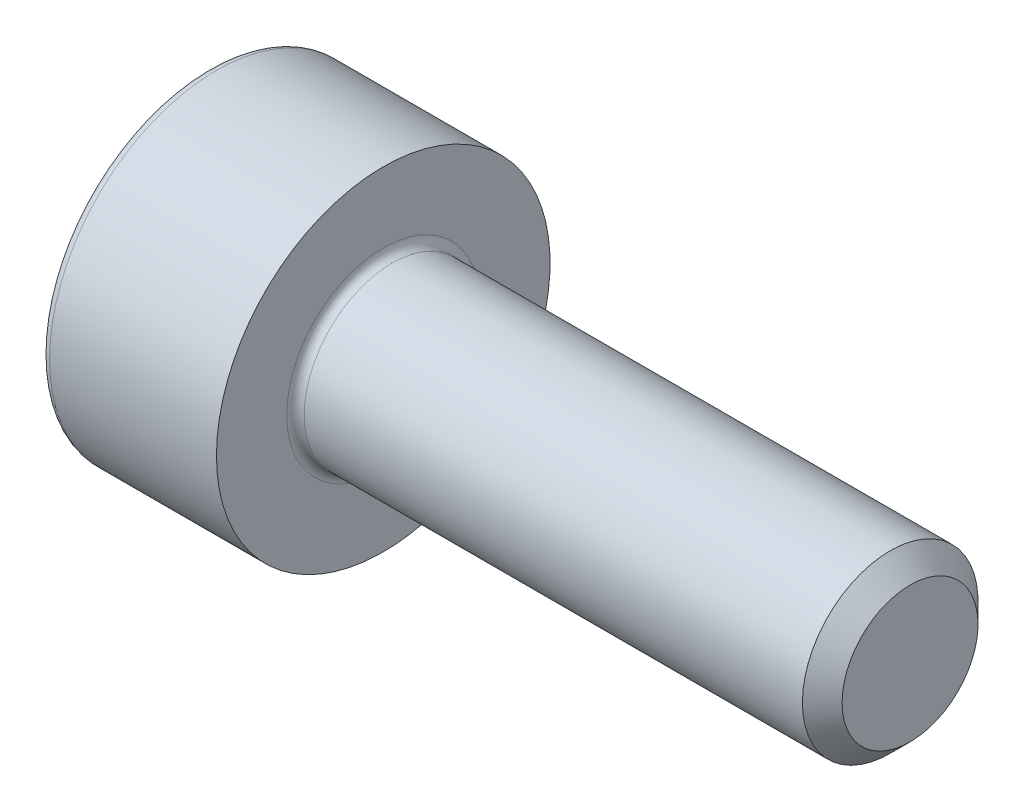
ISO-10303-21;
HEADER;
FILE_DESCRIPTION(('STEP AP214'),'2;1');
FILE_NAME('part.step','',(''),(''),'','','');
FILE_SCHEMA(('AUTOMOTIVE_DESIGN { 1 0 10303 214 1 1 1 1 }'));
ENDSEC;
DATA;
#1=APPLICATION_CONTEXT('core data for automotive mechanical design processes');
#2=APPLICATION_PROTOCOL_DEFINITION('international standard','automotive_design',2000,#1);
#3=PRODUCT_CONTEXT('',#1,'mechanical');
#4=PRODUCT('Part','Part','',(#3));
#5=PRODUCT_RELATED_PRODUCT_CATEGORY('part','',(#4));
#6=PRODUCT_DEFINITION_FORMATION('','',#4);
#7=PRODUCT_DEFINITION_CONTEXT('part definition',#1,'design');
#8=PRODUCT_DEFINITION('design','',#6,#7);
#9=PRODUCT_DEFINITION_SHAPE('','',#8);
#10=(LENGTH_UNIT() NAMED_UNIT(*) SI_UNIT(.MILLI.,.METRE.));
#11=(NAMED_UNIT(*) PLANE_ANGLE_UNIT() SI_UNIT($,.RADIAN.));
#12=(NAMED_UNIT(*) SI_UNIT($,.STERADIAN.) SOLID_ANGLE_UNIT());
#13=UNCERTAINTY_MEASURE_WITH_UNIT(LENGTH_MEASURE(1.E-05),#10,'distance_accuracy_value','');
#14=(GEOMETRIC_REPRESENTATION_CONTEXT(3) GLOBAL_UNCERTAINTY_ASSIGNED_CONTEXT((#13)) GLOBAL_UNIT_ASSIGNED_CONTEXT((#10,
#11,#12)) REPRESENTATION_CONTEXT('',''));
#15=CARTESIAN_POINT('',(0.,0.,0.));
#16=DIRECTION('',(0.,0.,1.));
#17=DIRECTION('',(1.,0.,0.));
#18=AXIS2_PLACEMENT_3D('',#15,#16,#17);
#19=CARTESIAN_POINT('',(0.,0.,0.));
#20=DIRECTION('',(-1.,0.,0.));
#21=DIRECTION('',(0.,0.,1.));
#22=AXIS2_PLACEMENT_3D('',#19,#20,#21);
#23=PLANE('',#22);
#24=DIRECTION('',(0.,-0.499999999999999,0.866025403784439));
#25=VECTOR('',#24,1.);
#26=CARTESIAN_POINT('',(0.,0.892006165897972,0.));
#27=LINE('',#26,#25);
#28=CARTESIAN_POINT('',(0.,0.892006165897972,0.));
#29=VERTEX_POINT('',#28);
#30=CARTESIAN_POINT('',(0.,0.446003082948987,0.772499999999999));
#31=VERTEX_POINT('',#30);
#32=EDGE_CURVE('E265',#29,#31,#27,.T.);
#33=ORIENTED_EDGE('',*,*,#32,.T.);
#34=DIRECTION('',(0.,1.,0.));
#35=VECTOR('',#34,1.);
#36=CARTESIAN_POINT('',(0.,-0.446003082948984,0.7725));
#37=LINE('',#36,#35);
#38=CARTESIAN_POINT('',(0.,-0.446003082948984,0.7725));
#39=VERTEX_POINT('',#38);
#40=EDGE_CURVE('E137',#39,#31,#37,.T.);
#41=ORIENTED_EDGE('',*,*,#40,.F.);
#42=DIRECTION('',(0.,-0.500000000000001,-0.866025403784438));
#43=VECTOR('',#42,1.);
#44=CARTESIAN_POINT('',(0.,-0.446003082948984,0.7725));
#45=LINE('',#44,#43);
#46=CARTESIAN_POINT('',(0.,-0.892006165897971,0.));
#47=VERTEX_POINT('',#46);
#48=EDGE_CURVE('E268',#39,#47,#45,.T.);
#49=ORIENTED_EDGE('',*,*,#48,.T.);
#50=DIRECTION('',(0.,0.499999999999997,-0.86602540378444));
#51=VECTOR('',#50,1.);
#52=CARTESIAN_POINT('',(0.,-0.892006165897971,0.));
#53=LINE('',#52,#51);
#54=CARTESIAN_POINT('',(0.,-0.446003082948987,-0.772500000000001));
#55=VERTEX_POINT('',#54);
#56=EDGE_CURVE('E271',#47,#55,#53,.T.);
#57=ORIENTED_EDGE('',*,*,#56,.T.);
#58=DIRECTION('',(0.,-1.,0.));
#59=VECTOR('',#58,1.);
#60=CARTESIAN_POINT('',(0.,0.446003082948986,-0.772500000000001));
#61=LINE('',#60,#59);
#62=CARTESIAN_POINT('',(0.,0.446003082948986,-0.772500000000001));
#63=VERTEX_POINT('',#62);
#64=EDGE_CURVE('E274',#63,#55,#61,.T.);
#65=ORIENTED_EDGE('',*,*,#64,.F.);
#66=DIRECTION('',(0.,-0.500000000000001,-0.866025403784438));
#67=VECTOR('',#66,1.);
#68=CARTESIAN_POINT('',(0.,0.892006165897972,0.));
#69=LINE('',#68,#67);
#70=EDGE_CURVE('E132',#29,#63,#69,.T.);
#71=ORIENTED_EDGE('',*,*,#70,.F.);
#72=EDGE_LOOP('',(#33,#41,#49,#57,#65,#71));
#73=FACE_BOUND('',#72,.T.);
#74=CARTESIAN_POINT('',(0.,0.,0.));
#75=DIRECTION('',(-1.,0.,0.));
#76=DIRECTION('',(0.,0.,1.));
#77=AXIS2_PLACEMENT_3D('',#74,#75,#76);
#78=CIRCLE('',#77,1.8);
#79=CARTESIAN_POINT('',(0.,0.,1.8));
#80=VERTEX_POINT('',#79);
#81=EDGE_CURVE('E49',#80,#80,#78,.T.);
#82=ORIENTED_EDGE('',*,*,#81,.T.);
#83=EDGE_LOOP('',(#82));
#84=FACE_BOUND('',#83,.T.);
#85=ADVANCED_FACE('F41',(#73,#84),#23,.T.);
#86=CARTESIAN_POINT('',(-31.75,0.,0.));
#87=DIRECTION('',(-1.,0.,0.));
#88=DIRECTION('',(0.,0.,1.));
#89=AXIS2_PLACEMENT_3D('',#86,#87,#88);
#90=CYLINDRICAL_SURFACE('',#89,1.9);
#91=CARTESIAN_POINT('',(0.100000000000003,0.,0.));
#92=DIRECTION('',(-1.,0.,0.));
#93=DIRECTION('',(0.,0.,1.));
#94=AXIS2_PLACEMENT_3D('',#91,#92,#93);
#95=CIRCLE('',#94,1.9);
#96=CARTESIAN_POINT('',(0.100000000000003,0.,1.9));
#97=VERTEX_POINT('',#96);
#98=EDGE_CURVE('E11',#97,#97,#95,.F.);
#99=ORIENTED_EDGE('',*,*,#98,.T.);
#100=EDGE_LOOP('',(#99));
#101=FACE_BOUND('',#100,.T.);
#102=CARTESIAN_POINT('',(2.,0.,0.));
#103=DIRECTION('',(-1.,0.,0.));
#104=DIRECTION('',(0.,0.,1.));
#105=AXIS2_PLACEMENT_3D('',#102,#103,#104);
#106=CIRCLE('',#105,1.9);
#107=CARTESIAN_POINT('',(2.,0.,1.9));
#108=VERTEX_POINT('',#107);
#109=EDGE_CURVE('E155',#108,#108,#106,.T.);
#110=ORIENTED_EDGE('',*,*,#109,.T.);
#111=EDGE_LOOP('',(#110));
#112=FACE_BOUND('',#111,.T.);
#113=ADVANCED_FACE('F179',(#101,#112),#90,.T.);
#114=CARTESIAN_POINT('',(2.,1.9,0.));
#115=DIRECTION('',(1.,0.,0.));
#116=DIRECTION('',(0.,0.,-1.));
#117=AXIS2_PLACEMENT_3D('',#114,#115,#116);
#118=PLANE('',#117);
#119=CARTESIAN_POINT('',(2.,0.,0.));
#120=DIRECTION('',(1.,0.,0.));
#121=DIRECTION('',(0.,0.,-1.));
#122=AXIS2_PLACEMENT_3D('',#119,#120,#121);
#123=CIRCLE('',#122,1.1);
#124=CARTESIAN_POINT('',(2.,0.,-1.1));
#125=VERTEX_POINT('',#124);
#126=EDGE_CURVE('E158',#125,#125,#123,.F.);
#127=ORIENTED_EDGE('',*,*,#126,.T.);
#128=EDGE_LOOP('',(#127));
#129=FACE_BOUND('',#128,.T.);
#130=ORIENTED_EDGE('',*,*,#109,.F.);
#131=EDGE_LOOP('',(#130));
#132=FACE_BOUND('',#131,.T.);
#133=ADVANCED_FACE('F185',(#129,#132),#118,.T.);
#134=CARTESIAN_POINT('',(-31.75,0.,0.));
#135=DIRECTION('',(-1.,0.,0.));
#136=DIRECTION('',(0.,0.,1.));
#137=AXIS2_PLACEMENT_3D('',#134,#135,#136);
#138=CYLINDRICAL_SURFACE('',#137,1.);
#139=CARTESIAN_POINT('',(2.1,0.,0.));
#140=DIRECTION('',(1.,0.,0.));
#141=DIRECTION('',(0.,0.,-1.));
#142=AXIS2_PLACEMENT_3D('',#139,#140,#141);
#143=CIRCLE('',#142,1.);
#144=CARTESIAN_POINT('',(2.1,0.,-1.));
#145=VERTEX_POINT('',#144);
#146=EDGE_CURVE('E161',#145,#145,#143,.T.);
#147=ORIENTED_EDGE('',*,*,#146,.T.);
#148=EDGE_LOOP('',(#147));
#149=FACE_BOUND('',#148,.T.);
#150=CARTESIAN_POINT('',(7.77400000000002,0.,0.));
#151=DIRECTION('',(-1.,0.,0.));
#152=DIRECTION('',(0.,0.,1.));
#153=AXIS2_PLACEMENT_3D('',#150,#151,#152);
#154=CIRCLE('',#153,1.);
#155=CARTESIAN_POINT('',(7.77400000000002,0.,1.));
#156=VERTEX_POINT('',#155);
#157=EDGE_CURVE('E152',#156,#156,#154,.T.);
#158=ORIENTED_EDGE('',*,*,#157,.T.);
#159=EDGE_LOOP('',(#158));
#160=FACE_BOUND('',#159,.T.);
#161=ADVANCED_FACE('F191',(#149,#160),#138,.T.);
#162=CARTESIAN_POINT('',(8.00000000000001,0.,0.));
#163=DIRECTION('',(-1.,0.,0.));
#164=DIRECTION('',(0.,0.,1.));
#165=AXIS2_PLACEMENT_3D('',#162,#163,#164);
#166=CONICAL_SURFACE('',#165,0.774,0.785398163397475);
#167=ORIENTED_EDGE('',*,*,#157,.F.);
#168=EDGE_LOOP('',(#167));
#169=FACE_BOUND('',#168,.T.);
#170=CARTESIAN_POINT('',(8.00000000000001,0.,0.));
#171=DIRECTION('',(-1.,0.,0.));
#172=DIRECTION('',(0.,0.,1.));
#173=AXIS2_PLACEMENT_3D('',#170,#171,#172);
#174=CIRCLE('',#173,0.774);
#175=CARTESIAN_POINT('',(8.00000000000001,0.,0.774));
#176=VERTEX_POINT('',#175);
#177=EDGE_CURVE('E148',#176,#176,#174,.T.);
#178=ORIENTED_EDGE('',*,*,#177,.T.);
#179=EDGE_LOOP('',(#178));
#180=FACE_BOUND('',#179,.T.);
#181=ADVANCED_FACE('F195',(#169,#180),#166,.T.);
#182=CARTESIAN_POINT('',(8.00000000000001,0.774,0.));
#183=DIRECTION('',(1.,0.,0.));
#184=DIRECTION('',(0.,0.,-1.));
#185=AXIS2_PLACEMENT_3D('',#182,#183,#184);
#186=PLANE('',#185);
#187=ORIENTED_EDGE('',*,*,#177,.F.);
#188=EDGE_LOOP('',(#187));
#189=FACE_BOUND('',#188,.T.);
#190=ADVANCED_FACE('F175',(#189),#186,.T.);
#191=CARTESIAN_POINT('',(2.1,0.,0.));
#192=DIRECTION('',(1.,0.,0.));
#193=DIRECTION('',(0.,0.,-1.));
#194=AXIS2_PLACEMENT_3D('',#191,#192,#193);
#195=TOROIDAL_SURFACE('',#194,1.1,0.1);
#196=ORIENTED_EDGE('',*,*,#146,.F.);
#197=EDGE_LOOP('',(#196));
#198=FACE_BOUND('',#197,.T.);
#199=ORIENTED_EDGE('',*,*,#126,.F.);
#200=EDGE_LOOP('',(#199));
#201=FACE_BOUND('',#200,.T.);
#202=ADVANCED_FACE('F168',(#198,#201),#195,.F.);
#203=CARTESIAN_POINT('',(0.100000000000003,0.,0.));
#204=DIRECTION('',(-1.,0.,0.));
#205=DIRECTION('',(0.,0.,1.));
#206=AXIS2_PLACEMENT_3D('',#203,#204,#205);
#207=TOROIDAL_SURFACE('',#206,1.8,0.1);
#208=ORIENTED_EDGE('',*,*,#98,.F.);
#209=EDGE_LOOP('',(#208));
#210=FACE_BOUND('',#209,.T.);
#211=ORIENTED_EDGE('',*,*,#81,.F.);
#212=EDGE_LOOP('',(#211));
#213=FACE_BOUND('',#212,.T.);
#214=ADVANCED_FACE('F43',(#210,#213),#207,.T.);
#215=CARTESIAN_POINT('',(1.,0.892006165897972,0.));
#216=DIRECTION('',(0.,-0.866025403784439,-0.499999999999999));
#217=DIRECTION('',(0.,0.499999999999999,-0.866025403784439));
#218=AXIS2_PLACEMENT_3D('',#215,#216,#217);
#219=PLANE('',#218);
#220=ORIENTED_EDGE('',*,*,#32,.F.);
#221=DIRECTION('',(-1.,0.,0.));
#222=VECTOR('',#221,1.);
#223=CARTESIAN_POINT('',(1.,0.892006165897972,0.));
#224=LINE('',#223,#222);
#225=CARTESIAN_POINT('',(1.,0.892006165897972,0.));
#226=VERTEX_POINT('',#225);
#227=EDGE_CURVE('E255',#226,#29,#224,.T.);
#228=ORIENTED_EDGE('',*,*,#227,.F.);
#229=DIRECTION('',(0.,-0.499999999999999,0.866025403784439));
#230=VECTOR('',#229,1.);
#231=CARTESIAN_POINT('',(1.,0.892006165897972,0.));
#232=LINE('',#231,#230);
#233=CARTESIAN_POINT('',(1.,0.669004624423479,0.386249999999999));
#234=VERTEX_POINT('',#233);
#235=EDGE_CURVE('E124',#226,#234,#232,.T.);
#236=ORIENTED_EDGE('',*,*,#235,.T.);
#237=CARTESIAN_POINT('',(1.,0.446003082948987,0.772499999999999));
#238=VERTEX_POINT('',#237);
#239=EDGE_CURVE('E115',#234,#238,#232,.T.);
#240=ORIENTED_EDGE('',*,*,#239,.T.);
#241=DIRECTION('',(-1.,0.,0.));
#242=VECTOR('',#241,1.);
#243=CARTESIAN_POINT('',(1.,0.446003082948987,0.772499999999999));
#244=LINE('',#243,#242);
#245=EDGE_CURVE('E129',#238,#31,#244,.T.);
#246=ORIENTED_EDGE('',*,*,#245,.T.);
#247=EDGE_LOOP('',(#220,#228,#236,#240,#246));
#248=FACE_BOUND('',#247,.T.);
#249=ADVANCED_FACE('F128',(#248),#219,.T.);
#250=CARTESIAN_POINT('',(1.,-0.446003082948984,0.7725));
#251=DIRECTION('',(0.,0.,1.));
#252=DIRECTION('',(0.,-1.,0.));
#253=AXIS2_PLACEMENT_3D('',#250,#251,#252);
#254=PLANE('',#253);
#255=ORIENTED_EDGE('',*,*,#40,.T.);
#256=ORIENTED_EDGE('',*,*,#245,.F.);
#257=DIRECTION('',(0.,1.,0.));
#258=VECTOR('',#257,1.);
#259=CARTESIAN_POINT('',(1.,-0.446003082948984,0.7725));
#260=LINE('',#259,#258);
#261=CARTESIAN_POINT('',(1.,0.,0.772499999999999));
#262=VERTEX_POINT('',#261);
#263=EDGE_CURVE('E112',#262,#238,#260,.T.);
#264=ORIENTED_EDGE('',*,*,#263,.F.);
#265=CARTESIAN_POINT('',(1.,-0.446003082948984,0.7725));
#266=VERTEX_POINT('',#265);
#267=EDGE_CURVE('E123',#266,#262,#260,.T.);
#268=ORIENTED_EDGE('',*,*,#267,.F.);
#269=DIRECTION('',(-1.,0.,0.));
#270=VECTOR('',#269,1.);
#271=CARTESIAN_POINT('',(1.,-0.446003082948984,0.7725));
#272=LINE('',#271,#270);
#273=EDGE_CURVE('E139',#266,#39,#272,.T.);
#274=ORIENTED_EDGE('',*,*,#273,.T.);
#275=EDGE_LOOP('',(#255,#256,#264,#268,#274));
#276=FACE_BOUND('',#275,.T.);
#277=ADVANCED_FACE('F134',(#276),#254,.F.);
#278=CARTESIAN_POINT('',(1.,-0.446003082948984,0.7725));
#279=DIRECTION('',(0.,0.866025403784438,-0.500000000000001));
#280=DIRECTION('',(0.,0.500000000000001,0.866025403784438));
#281=AXIS2_PLACEMENT_3D('',#278,#279,#280);
#282=PLANE('',#281);
#283=ORIENTED_EDGE('',*,*,#48,.F.);
#284=ORIENTED_EDGE('',*,*,#273,.F.);
#285=DIRECTION('',(0.,-0.500000000000001,-0.866025403784438));
#286=VECTOR('',#285,1.);
#287=CARTESIAN_POINT('',(1.,-0.446003082948984,0.7725));
#288=LINE('',#287,#286);
#289=CARTESIAN_POINT('',(1.,-0.669004624423477,0.38625));
#290=VERTEX_POINT('',#289);
#291=EDGE_CURVE('E294',#266,#290,#288,.T.);
#292=ORIENTED_EDGE('',*,*,#291,.T.);
#293=CARTESIAN_POINT('',(1.,-0.892006165897971,0.));
#294=VERTEX_POINT('',#293);
#295=EDGE_CURVE('E283',#290,#294,#288,.T.);
#296=ORIENTED_EDGE('',*,*,#295,.T.);
#297=DIRECTION('',(-1.,0.,0.));
#298=VECTOR('',#297,1.);
#299=CARTESIAN_POINT('',(1.,-0.892006165897971,0.));
#300=LINE('',#299,#298);
#301=EDGE_CURVE('E144',#294,#47,#300,.T.);
#302=ORIENTED_EDGE('',*,*,#301,.T.);
#303=EDGE_LOOP('',(#283,#284,#292,#296,#302));
#304=FACE_BOUND('',#303,.T.);
#305=ADVANCED_FACE('F209',(#304),#282,.T.);
#306=CARTESIAN_POINT('',(1.,-0.892006165897971,0.));
#307=DIRECTION('',(0.,0.86602540378444,0.499999999999997));
#308=DIRECTION('',(0.,-0.499999999999997,0.86602540378444));
#309=AXIS2_PLACEMENT_3D('',#306,#307,#308);
#310=PLANE('',#309);
#311=ORIENTED_EDGE('',*,*,#56,.F.);
#312=ORIENTED_EDGE('',*,*,#301,.F.);
#313=DIRECTION('',(0.,0.499999999999997,-0.86602540378444));
#314=VECTOR('',#313,1.);
#315=CARTESIAN_POINT('',(1.,-0.892006165897971,0.));
#316=LINE('',#315,#314);
#317=CARTESIAN_POINT('',(1.,-0.66900462442348,-0.386249999999998));
#318=VERTEX_POINT('',#317);
#319=EDGE_CURVE('E261',#294,#318,#316,.T.);
#320=ORIENTED_EDGE('',*,*,#319,.T.);
#321=CARTESIAN_POINT('',(1.,-0.446003082948987,-0.772500000000001));
#322=VERTEX_POINT('',#321);
#323=EDGE_CURVE('E293',#318,#322,#316,.T.);
#324=ORIENTED_EDGE('',*,*,#323,.T.);
#325=DIRECTION('',(-1.,0.,0.));
#326=VECTOR('',#325,1.);
#327=CARTESIAN_POINT('',(1.,-0.446003082948987,-0.772500000000001));
#328=LINE('',#327,#326);
#329=EDGE_CURVE('E254',#322,#55,#328,.T.);
#330=ORIENTED_EDGE('',*,*,#329,.T.);
#331=EDGE_LOOP('',(#311,#312,#320,#324,#330));
#332=FACE_BOUND('',#331,.T.);
#333=ADVANCED_FACE('F212',(#332),#310,.T.);
#334=CARTESIAN_POINT('',(1.,0.446003082948986,-0.772500000000001));
#335=DIRECTION('',(0.,0.,-1.));
#336=DIRECTION('',(0.,1.,0.));
#337=AXIS2_PLACEMENT_3D('',#334,#335,#336);
#338=PLANE('',#337);
#339=ORIENTED_EDGE('',*,*,#64,.T.);
#340=ORIENTED_EDGE('',*,*,#329,.F.);
#341=DIRECTION('',(0.,-1.,0.));
#342=VECTOR('',#341,1.);
#343=CARTESIAN_POINT('',(1.,0.446003082948986,-0.772500000000001));
#344=LINE('',#343,#342);
#345=CARTESIAN_POINT('',(1.,0.,-0.772500000000001));
#346=VERTEX_POINT('',#345);
#347=EDGE_CURVE('E258',#346,#322,#344,.T.);
#348=ORIENTED_EDGE('',*,*,#347,.F.);
#349=CARTESIAN_POINT('',(1.,0.446003082948986,-0.772500000000001));
#350=VERTEX_POINT('',#349);
#351=EDGE_CURVE('E56',#350,#346,#344,.T.);
#352=ORIENTED_EDGE('',*,*,#351,.F.);
#353=DIRECTION('',(-1.,0.,0.));
#354=VECTOR('',#353,1.);
#355=CARTESIAN_POINT('',(1.,0.446003082948986,-0.772500000000001));
#356=LINE('',#355,#354);
#357=EDGE_CURVE('E251',#350,#63,#356,.T.);
#358=ORIENTED_EDGE('',*,*,#357,.T.);
#359=EDGE_LOOP('',(#339,#340,#348,#352,#358));
#360=FACE_BOUND('',#359,.T.);
#361=ADVANCED_FACE('F216',(#360),#338,.F.);
#362=CARTESIAN_POINT('',(1.,0.892006165897972,0.));
#363=DIRECTION('',(0.,0.866025403784438,-0.500000000000001));
#364=DIRECTION('',(0.,0.500000000000001,0.866025403784438));
#365=AXIS2_PLACEMENT_3D('',#362,#363,#364);
#366=PLANE('',#365);
#367=ORIENTED_EDGE('',*,*,#70,.T.);
#368=ORIENTED_EDGE('',*,*,#357,.F.);
#369=DIRECTION('',(0.,-0.500000000000001,-0.866025403784438));
#370=VECTOR('',#369,1.);
#371=CARTESIAN_POINT('',(1.,0.892006165897972,0.));
#372=LINE('',#371,#370);
#373=CARTESIAN_POINT('',(1.,0.669004624423479,-0.386250000000001));
#374=VERTEX_POINT('',#373);
#375=EDGE_CURVE('E241',#374,#350,#372,.T.);
#376=ORIENTED_EDGE('',*,*,#375,.F.);
#377=EDGE_CURVE('E247',#226,#374,#372,.T.);
#378=ORIENTED_EDGE('',*,*,#377,.F.);
#379=ORIENTED_EDGE('',*,*,#227,.T.);
#380=EDGE_LOOP('',(#367,#368,#376,#378,#379));
#381=FACE_BOUND('',#380,.T.);
#382=ADVANCED_FACE('F220',(#381),#366,.F.);
#383=CARTESIAN_POINT('',(1.,1.33800924884696,-0.7725));
#384=DIRECTION('',(1.,0.,0.));
#385=DIRECTION('',(0.,0.,-1.));
#386=AXIS2_PLACEMENT_3D('',#383,#384,#385);
#387=PLANE('',#386);
#388=ORIENTED_EDGE('',*,*,#347,.T.);
#389=ORIENTED_EDGE('',*,*,#323,.F.);
#390=CARTESIAN_POINT('',(1.,0.,0.));
#391=DIRECTION('',(-1.,0.,0.));
#392=DIRECTION('',(0.,0.,1.));
#393=AXIS2_PLACEMENT_3D('',#390,#391,#392);
#394=CIRCLE('',#393,0.772500000000001);
#395=EDGE_CURVE('E289',#346,#318,#394,.T.);
#396=ORIENTED_EDGE('',*,*,#395,.F.);
#397=EDGE_LOOP('',(#388,#389,#396));
#398=FACE_BOUND('',#397,.T.);
#399=ADVANCED_FACE('F224',(#398),#387,.F.);
#400=ORIENTED_EDGE('',*,*,#319,.F.);
#401=ORIENTED_EDGE('',*,*,#295,.F.);
#402=EDGE_CURVE('E142',#318,#290,#394,.T.);
#403=ORIENTED_EDGE('',*,*,#402,.F.);
#404=EDGE_LOOP('',(#400,#401,#403));
#405=FACE_BOUND('',#404,.T.);
#406=ADVANCED_FACE('F227',(#405),#387,.F.);
#407=ORIENTED_EDGE('',*,*,#291,.F.);
#408=ORIENTED_EDGE('',*,*,#267,.T.);
#409=EDGE_CURVE('E138',#290,#262,#394,.T.);
#410=ORIENTED_EDGE('',*,*,#409,.F.);
#411=EDGE_LOOP('',(#407,#408,#410));
#412=FACE_BOUND('',#411,.T.);
#413=ADVANCED_FACE('F232',(#412),#387,.F.);
#414=ORIENTED_EDGE('',*,*,#263,.T.);
#415=ORIENTED_EDGE('',*,*,#239,.F.);
#416=EDGE_CURVE('E118',#262,#234,#394,.T.);
#417=ORIENTED_EDGE('',*,*,#416,.F.);
#418=EDGE_LOOP('',(#414,#415,#417));
#419=FACE_BOUND('',#418,.T.);
#420=ADVANCED_FACE('F114',(#419),#387,.F.);
#421=ORIENTED_EDGE('',*,*,#235,.F.);
#422=ORIENTED_EDGE('',*,*,#377,.T.);
#423=EDGE_CURVE('E149',#234,#374,#394,.T.);
#424=ORIENTED_EDGE('',*,*,#423,.F.);
#425=EDGE_LOOP('',(#421,#422,#424));
#426=FACE_BOUND('',#425,.T.);
#427=ADVANCED_FACE('F235',(#426),#387,.F.);
#428=ORIENTED_EDGE('',*,*,#375,.T.);
#429=ORIENTED_EDGE('',*,*,#351,.T.);
#430=EDGE_CURVE('E244',#374,#346,#394,.T.);
#431=ORIENTED_EDGE('',*,*,#430,.F.);
#432=EDGE_LOOP('',(#428,#429,#431));
#433=FACE_BOUND('',#432,.T.);
#434=ADVANCED_FACE('F205',(#433),#387,.F.);
#435=CARTESIAN_POINT('',(1.,0.,0.));
#436=DIRECTION('',(-1.,0.,0.));
#437=DIRECTION('',(0.,0.,1.));
#438=AXIS2_PLACEMENT_3D('',#435,#436,#437);
#439=CONICAL_SURFACE('',#438,0.772500000000001,1.04719755119659);
#440=CARTESIAN_POINT('',(1.446003082949,0.,0.));
#441=VERTEX_POINT('',#440);
#442=VERTEX_LOOP('',#441);
#443=FACE_BOUND('',#442,.T.);
#444=ORIENTED_EDGE('',*,*,#416,.T.);
#445=ORIENTED_EDGE('',*,*,#423,.T.);
#446=ORIENTED_EDGE('',*,*,#430,.T.);
#447=ORIENTED_EDGE('',*,*,#395,.T.);
#448=ORIENTED_EDGE('',*,*,#402,.T.);
#449=ORIENTED_EDGE('',*,*,#409,.T.);
#450=EDGE_LOOP('',(#444,#445,#446,#447,#448,#449));
#451=FACE_BOUND('',#450,.T.);
#452=ADVANCED_FACE('F203',(#443,#451),#439,.F.);
#453=CLOSED_SHELL('',(#85,#113,#133,#161,#181,#190,#202,#214,#249,#277,#305,#333,#361,#382,#399,
#406,#413,#420,#427,#434,#452));
#454=MANIFOLD_SOLID_BREP('B2',#453);
#455=ADVANCED_BREP_SHAPE_REPRESENTATION('',(#18,#454),#14);
#456=SHAPE_DEFINITION_REPRESENTATION(#9,#455);
ENDSEC;
END-ISO-10303-21;
